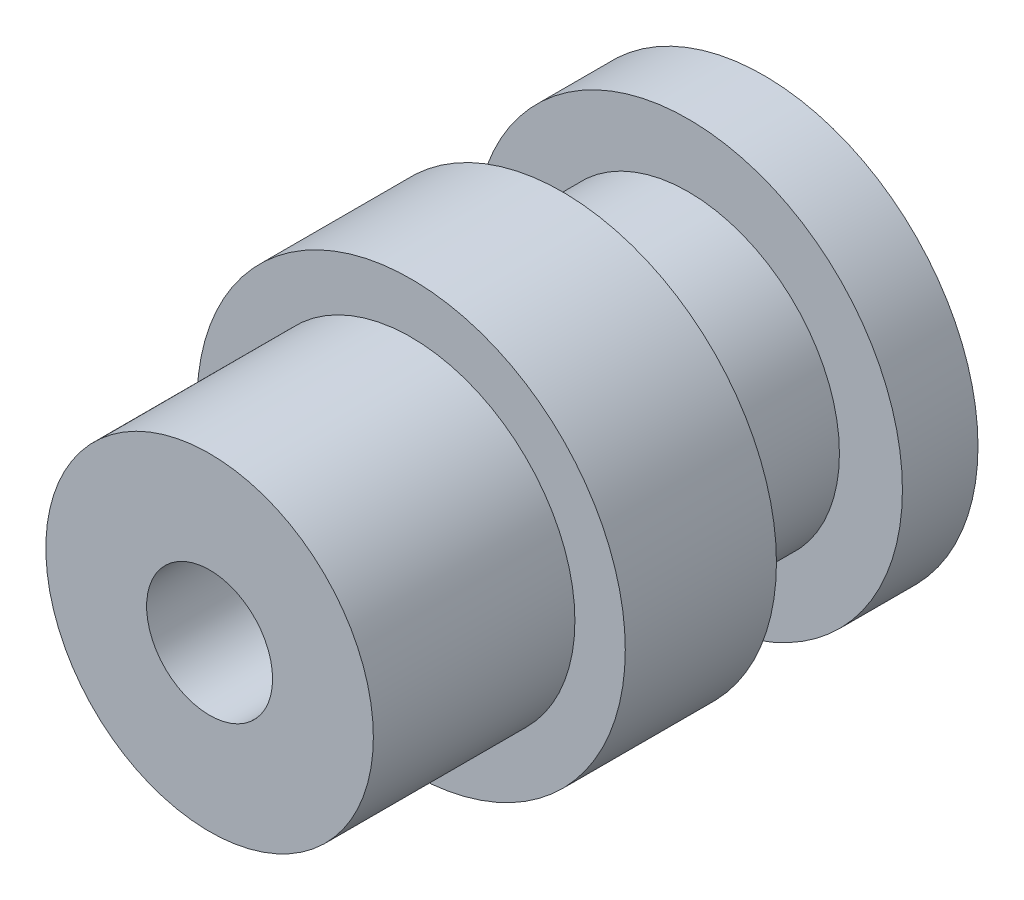
ISO-10303-21;
HEADER;
FILE_DESCRIPTION(('STEP AP214'),'2;1');
FILE_NAME('part.step','',(''),(''),'','','');
FILE_SCHEMA(('AUTOMOTIVE_DESIGN { 1 0 10303 214 1 1 1 1 }'));
ENDSEC;
DATA;
#1=APPLICATION_CONTEXT('core data for automotive mechanical design processes');
#2=APPLICATION_PROTOCOL_DEFINITION('international standard','automotive_design',2000,#1);
#3=PRODUCT_CONTEXT('',#1,'mechanical');
#4=PRODUCT('Part','Part','',(#3));
#5=PRODUCT_RELATED_PRODUCT_CATEGORY('part','',(#4));
#6=PRODUCT_DEFINITION_FORMATION('','',#4);
#7=PRODUCT_DEFINITION_CONTEXT('part definition',#1,'design');
#8=PRODUCT_DEFINITION('design','',#6,#7);
#9=PRODUCT_DEFINITION_SHAPE('','',#8);
#10=(LENGTH_UNIT() NAMED_UNIT(*) SI_UNIT(.MILLI.,.METRE.));
#11=(NAMED_UNIT(*) PLANE_ANGLE_UNIT() SI_UNIT($,.RADIAN.));
#12=(NAMED_UNIT(*) SI_UNIT($,.STERADIAN.) SOLID_ANGLE_UNIT());
#13=UNCERTAINTY_MEASURE_WITH_UNIT(LENGTH_MEASURE(1.E-05),#10,'distance_accuracy_value','');
#14=(GEOMETRIC_REPRESENTATION_CONTEXT(3) GLOBAL_UNCERTAINTY_ASSIGNED_CONTEXT((#13)) GLOBAL_UNIT_ASSIGNED_CONTEXT((#10,
#11,#12)) REPRESENTATION_CONTEXT('',''));
#15=CARTESIAN_POINT('',(0.,0.,0.));
#16=DIRECTION('',(0.,0.,1.));
#17=DIRECTION('',(1.,0.,0.));
#18=AXIS2_PLACEMENT_3D('',#15,#16,#17);
#19=CARTESIAN_POINT('',(0.,0.,0.));
#20=DIRECTION('',(0.,0.,-1.));
#21=DIRECTION('',(-1.,0.,0.));
#22=AXIS2_PLACEMENT_3D('',#19,#20,#21);
#23=CYLINDRICAL_SURFACE('',#22,6.);
#24=CARTESIAN_POINT('',(0.,0.,0.));
#25=DIRECTION('',(0.,0.,1.));
#26=DIRECTION('',(1.,0.,0.));
#27=AXIS2_PLACEMENT_3D('',#24,#25,#26);
#28=CIRCLE('',#27,6.);
#29=CARTESIAN_POINT('',(6.,0.,0.));
#30=VERTEX_POINT('',#29);
#31=EDGE_CURVE('E51',#30,#30,#28,.T.);
#32=ORIENTED_EDGE('',*,*,#31,.F.);
#33=EDGE_LOOP('',(#32));
#34=FACE_BOUND('',#33,.T.);
#35=CARTESIAN_POINT('',(0.,0.,-5.));
#36=DIRECTION('',(0.,0.,1.));
#37=DIRECTION('',(1.,0.,0.));
#38=AXIS2_PLACEMENT_3D('',#35,#36,#37);
#39=CIRCLE('',#38,6.);
#40=CARTESIAN_POINT('',(6.,0.,-5.));
#41=VERTEX_POINT('',#40);
#42=EDGE_CURVE('E46',#41,#41,#39,.T.);
#43=ORIENTED_EDGE('',*,*,#42,.T.);
#44=EDGE_LOOP('',(#43));
#45=FACE_BOUND('',#44,.T.);
#46=ADVANCED_FACE('F43',(#34,#45),#23,.T.);
#47=CARTESIAN_POINT('',(0.,0.,-5.));
#48=DIRECTION('',(0.,0.,-1.));
#49=DIRECTION('',(-1.,0.,0.));
#50=AXIS2_PLACEMENT_3D('',#47,#48,#49);
#51=CYLINDRICAL_SURFACE('',#50,8.5);
#52=CARTESIAN_POINT('',(0.,0.,-5.));
#53=DIRECTION('',(0.,0.,1.));
#54=DIRECTION('',(1.,0.,0.));
#55=AXIS2_PLACEMENT_3D('',#52,#53,#54);
#56=CIRCLE('',#55,8.5);
#57=CARTESIAN_POINT('',(8.5,0.,-5.));
#58=VERTEX_POINT('',#57);
#59=EDGE_CURVE('E68',#58,#58,#56,.T.);
#60=ORIENTED_EDGE('',*,*,#59,.F.);
#61=EDGE_LOOP('',(#60));
#62=FACE_BOUND('',#61,.T.);
#63=CARTESIAN_POINT('',(0.,0.,-8.));
#64=DIRECTION('',(0.,0.,1.));
#65=DIRECTION('',(1.,0.,0.));
#66=AXIS2_PLACEMENT_3D('',#63,#64,#65);
#67=CIRCLE('',#66,8.5);
#68=CARTESIAN_POINT('',(8.5,0.,-8.));
#69=VERTEX_POINT('',#68);
#70=EDGE_CURVE('E61',#69,#69,#67,.T.);
#71=ORIENTED_EDGE('',*,*,#70,.T.);
#72=EDGE_LOOP('',(#71));
#73=FACE_BOUND('',#72,.T.);
#74=ADVANCED_FACE('F77',(#62,#73),#51,.T.);
#75=CARTESIAN_POINT('',(0.,0.,-5.));
#76=DIRECTION('',(0.,0.,1.));
#77=DIRECTION('',(1.,0.,0.));
#78=AXIS2_PLACEMENT_3D('',#75,#76,#77);
#79=PLANE('',#78);
#80=ORIENTED_EDGE('',*,*,#42,.F.);
#81=EDGE_LOOP('',(#80));
#82=FACE_BOUND('',#81,.T.);
#83=ORIENTED_EDGE('',*,*,#59,.T.);
#84=EDGE_LOOP('',(#83));
#85=FACE_BOUND('',#84,.T.);
#86=ADVANCED_FACE('F85',(#82,#85),#79,.T.);
#87=CARTESIAN_POINT('',(0.,0.,-8.));
#88=DIRECTION('',(0.,0.,1.));
#89=DIRECTION('',(1.,0.,0.));
#90=AXIS2_PLACEMENT_3D('',#87,#88,#89);
#91=PLANE('',#90);
#92=CARTESIAN_POINT('',(0.,0.,-8.));
#93=DIRECTION('',(0.,0.,1.));
#94=DIRECTION('',(1.,0.,0.));
#95=AXIS2_PLACEMENT_3D('',#92,#93,#94);
#96=CIRCLE('',#95,2.5);
#97=CARTESIAN_POINT('',(2.5,0.,-8.));
#98=VERTEX_POINT('',#97);
#99=EDGE_CURVE('E138',#98,#98,#96,.T.);
#100=ORIENTED_EDGE('',*,*,#99,.T.);
#101=EDGE_LOOP('',(#100));
#102=FACE_BOUND('',#101,.T.);
#103=ORIENTED_EDGE('',*,*,#70,.F.);
#104=EDGE_LOOP('',(#103));
#105=FACE_BOUND('',#104,.T.);
#106=ADVANCED_FACE('F76',(#102,#105),#91,.F.);
#107=CARTESIAN_POINT('',(0.,0.,6.));
#108=DIRECTION('',(0.,0.,-1.));
#109=DIRECTION('',(-1.,0.,0.));
#110=AXIS2_PLACEMENT_3D('',#107,#108,#109);
#111=CYLINDRICAL_SURFACE('',#110,8.5);
#112=CARTESIAN_POINT('',(0.,0.,6.));
#113=DIRECTION('',(0.,0.,1.));
#114=DIRECTION('',(1.,0.,0.));
#115=AXIS2_PLACEMENT_3D('',#112,#113,#114);
#116=CIRCLE('',#115,8.5);
#117=CARTESIAN_POINT('',(8.5,0.,6.));
#118=VERTEX_POINT('',#117);
#119=EDGE_CURVE('E63',#118,#118,#116,.T.);
#120=ORIENTED_EDGE('',*,*,#119,.F.);
#121=EDGE_LOOP('',(#120));
#122=FACE_BOUND('',#121,.T.);
#123=CARTESIAN_POINT('',(0.,0.,0.));
#124=DIRECTION('',(0.,0.,1.));
#125=DIRECTION('',(1.,0.,0.));
#126=AXIS2_PLACEMENT_3D('',#123,#124,#125);
#127=CIRCLE('',#126,8.5);
#128=CARTESIAN_POINT('',(8.5,0.,0.));
#129=VERTEX_POINT('',#128);
#130=EDGE_CURVE('E67',#129,#129,#127,.T.);
#131=ORIENTED_EDGE('',*,*,#130,.T.);
#132=EDGE_LOOP('',(#131));
#133=FACE_BOUND('',#132,.T.);
#134=ADVANCED_FACE('F84',(#122,#133),#111,.T.);
#135=CARTESIAN_POINT('',(0.,0.,6.));
#136=DIRECTION('',(0.,0.,1.));
#137=DIRECTION('',(1.,0.,0.));
#138=AXIS2_PLACEMENT_3D('',#135,#136,#137);
#139=PLANE('',#138);
#140=CARTESIAN_POINT('',(0.,0.,6.));
#141=DIRECTION('',(0.,0.,1.));
#142=DIRECTION('',(1.,0.,0.));
#143=AXIS2_PLACEMENT_3D('',#140,#141,#142);
#144=CIRCLE('',#143,6.5);
#145=CARTESIAN_POINT('',(6.5,0.,6.));
#146=VERTEX_POINT('',#145);
#147=EDGE_CURVE('E10',#146,#146,#144,.T.);
#148=ORIENTED_EDGE('',*,*,#147,.F.);
#149=EDGE_LOOP('',(#148));
#150=FACE_BOUND('',#149,.T.);
#151=ORIENTED_EDGE('',*,*,#119,.T.);
#152=EDGE_LOOP('',(#151));
#153=FACE_BOUND('',#152,.T.);
#154=ADVANCED_FACE('F93',(#150,#153),#139,.T.);
#155=CARTESIAN_POINT('',(0.,0.,0.));
#156=DIRECTION('',(0.,0.,1.));
#157=DIRECTION('',(1.,0.,0.));
#158=AXIS2_PLACEMENT_3D('',#155,#156,#157);
#159=PLANE('',#158);
#160=ORIENTED_EDGE('',*,*,#31,.T.);
#161=EDGE_LOOP('',(#160));
#162=FACE_BOUND('',#161,.T.);
#163=ORIENTED_EDGE('',*,*,#130,.F.);
#164=EDGE_LOOP('',(#163));
#165=FACE_BOUND('',#164,.T.);
#166=ADVANCED_FACE('F115',(#162,#165),#159,.F.);
#167=CARTESIAN_POINT('',(0.,0.,14.));
#168=DIRECTION('',(0.,0.,-1.));
#169=DIRECTION('',(-1.,0.,0.));
#170=AXIS2_PLACEMENT_3D('',#167,#168,#169);
#171=CYLINDRICAL_SURFACE('',#170,6.5);
#172=CARTESIAN_POINT('',(0.,0.,14.));
#173=DIRECTION('',(0.,0.,1.));
#174=DIRECTION('',(1.,0.,0.));
#175=AXIS2_PLACEMENT_3D('',#172,#173,#174);
#176=CIRCLE('',#175,6.5);
#177=CARTESIAN_POINT('',(6.5,0.,14.));
#178=VERTEX_POINT('',#177);
#179=EDGE_CURVE('E56',#178,#178,#176,.T.);
#180=ORIENTED_EDGE('',*,*,#179,.F.);
#181=EDGE_LOOP('',(#180));
#182=FACE_BOUND('',#181,.T.);
#183=ORIENTED_EDGE('',*,*,#147,.T.);
#184=EDGE_LOOP('',(#183));
#185=FACE_BOUND('',#184,.T.);
#186=ADVANCED_FACE('F113',(#182,#185),#171,.T.);
#187=CARTESIAN_POINT('',(0.,0.,14.));
#188=DIRECTION('',(0.,0.,1.));
#189=DIRECTION('',(1.,0.,0.));
#190=AXIS2_PLACEMENT_3D('',#187,#188,#189);
#191=PLANE('',#190);
#192=CARTESIAN_POINT('',(0.,0.,14.));
#193=DIRECTION('',(0.,0.,1.));
#194=DIRECTION('',(1.,0.,0.));
#195=AXIS2_PLACEMENT_3D('',#192,#193,#194);
#196=CIRCLE('',#195,2.5);
#197=CARTESIAN_POINT('',(2.5,0.,14.));
#198=VERTEX_POINT('',#197);
#199=EDGE_CURVE('E140',#198,#198,#196,.T.);
#200=ORIENTED_EDGE('',*,*,#199,.F.);
#201=EDGE_LOOP('',(#200));
#202=FACE_BOUND('',#201,.T.);
#203=ORIENTED_EDGE('',*,*,#179,.T.);
#204=EDGE_LOOP('',(#203));
#205=FACE_BOUND('',#204,.T.);
#206=ADVANCED_FACE('F124',(#202,#205),#191,.T.);
#207=CARTESIAN_POINT('',(0.,0.,14.));
#208=DIRECTION('',(0.,0.,-1.));
#209=DIRECTION('',(-1.,0.,0.));
#210=AXIS2_PLACEMENT_3D('',#207,#208,#209);
#211=CYLINDRICAL_SURFACE('',#210,2.5);
#212=ORIENTED_EDGE('',*,*,#199,.T.);
#213=EDGE_LOOP('',(#212));
#214=FACE_BOUND('',#213,.T.);
#215=ORIENTED_EDGE('',*,*,#99,.F.);
#216=EDGE_LOOP('',(#215));
#217=FACE_BOUND('',#216,.T.);
#218=ADVANCED_FACE('F129',(#214,#217),#211,.F.);
#219=CLOSED_SHELL('',(#46,#74,#86,#106,#134,#154,#166,#186,#206,#218));
#220=MANIFOLD_SOLID_BREP('B2',#219);
#221=ADVANCED_BREP_SHAPE_REPRESENTATION('',(#18,#220),#14);
#222=SHAPE_DEFINITION_REPRESENTATION(#9,#221);
ENDSEC;
END-ISO-10303-21;
